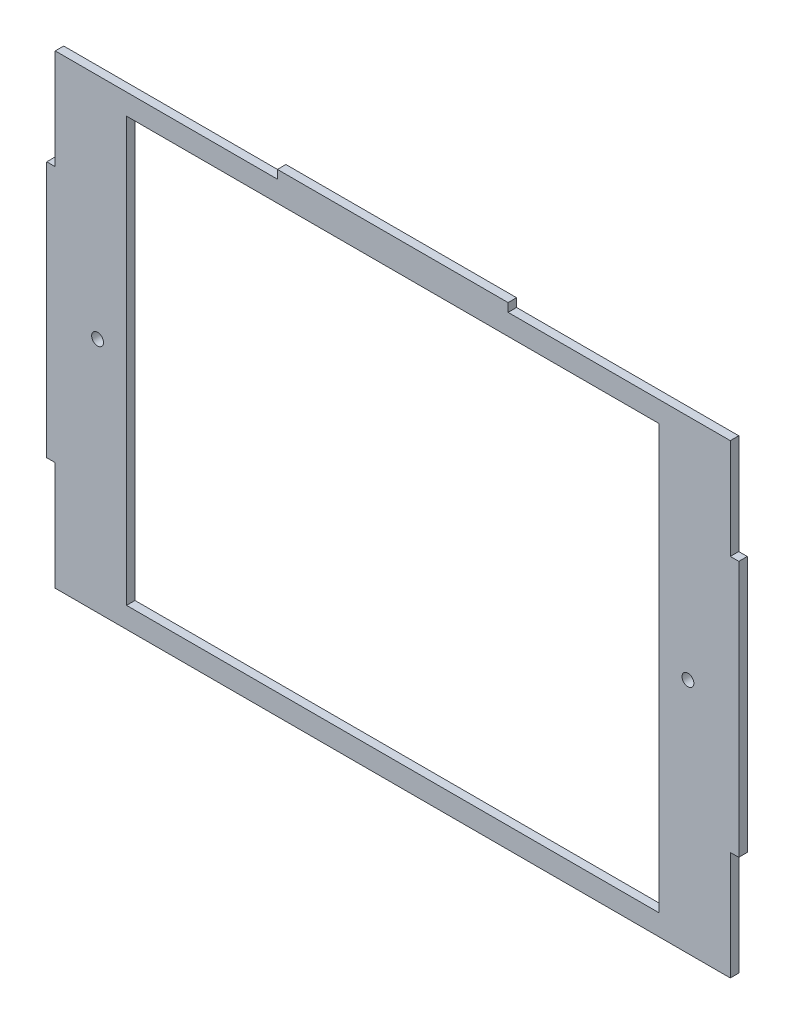
ISO-10303-21;
HEADER;
FILE_DESCRIPTION(('STEP AP214'),'2;1');
FILE_NAME('part.step','',(''),(''),'','','');
FILE_SCHEMA(('AUTOMOTIVE_DESIGN { 1 0 10303 214 1 1 1 1 }'));
ENDSEC;
DATA;
#1=APPLICATION_CONTEXT('core data for automotive mechanical design processes');
#2=APPLICATION_PROTOCOL_DEFINITION('international standard','automotive_design',2000,#1);
#3=PRODUCT_CONTEXT('',#1,'mechanical');
#4=PRODUCT('Part','Part','',(#3));
#5=PRODUCT_RELATED_PRODUCT_CATEGORY('part','',(#4));
#6=PRODUCT_DEFINITION_FORMATION('','',#4);
#7=PRODUCT_DEFINITION_CONTEXT('part definition',#1,'design');
#8=PRODUCT_DEFINITION('design','',#6,#7);
#9=PRODUCT_DEFINITION_SHAPE('','',#8);
#10=(LENGTH_UNIT() NAMED_UNIT(*) SI_UNIT(.MILLI.,.METRE.));
#11=(NAMED_UNIT(*) PLANE_ANGLE_UNIT() SI_UNIT($,.RADIAN.));
#12=(NAMED_UNIT(*) SI_UNIT($,.STERADIAN.) SOLID_ANGLE_UNIT());
#13=UNCERTAINTY_MEASURE_WITH_UNIT(LENGTH_MEASURE(1.E-05),#10,'distance_accuracy_value','');
#14=(GEOMETRIC_REPRESENTATION_CONTEXT(3) GLOBAL_UNCERTAINTY_ASSIGNED_CONTEXT((#13)) GLOBAL_UNIT_ASSIGNED_CONTEXT((#10,
#11,#12)) REPRESENTATION_CONTEXT('',''));
#15=CARTESIAN_POINT('',(0.,0.,0.));
#16=DIRECTION('',(0.,0.,1.));
#17=DIRECTION('',(1.,0.,0.));
#18=AXIS2_PLACEMENT_3D('',#15,#16,#17);
#19=CARTESIAN_POINT('',(0.,0.,0.));
#20=DIRECTION('',(0.,0.,-1.));
#21=DIRECTION('',(-1.,0.,0.));
#22=AXIS2_PLACEMENT_3D('',#19,#20,#21);
#23=PLANE('',#22);
#24=CARTESIAN_POINT('',(36.,167.75,0.));
#25=DIRECTION('',(0.,0.,1.));
#26=DIRECTION('',(1.,0.,0.));
#27=AXIS2_PLACEMENT_3D('',#24,#25,#26);
#28=CIRCLE('',#27,4.2);
#29=CARTESIAN_POINT('',(40.2,167.75,0.));
#30=VERTEX_POINT('',#29);
#31=EDGE_CURVE('E600',#30,#30,#28,.T.);
#32=ORIENTED_EDGE('',*,*,#31,.T.);
#33=EDGE_LOOP('',(#32));
#34=FACE_BOUND('',#33,.T.);
#35=DIRECTION('',(0.,-1.,0.));
#36=VECTOR('',#35,1.);
#37=CARTESIAN_POINT('',(56.5,14.75,0.));
#38=LINE('',#37,#36);
#39=CARTESIAN_POINT('',(56.5,314.75,0.));
#40=VERTEX_POINT('',#39);
#41=CARTESIAN_POINT('',(56.5,14.75,0.));
#42=VERTEX_POINT('',#41);
#43=EDGE_CURVE('E219',#40,#42,#38,.T.);
#44=ORIENTED_EDGE('',*,*,#43,.T.);
#45=DIRECTION('',(1.,0.,0.));
#46=VECTOR('',#45,1.);
#47=CARTESIAN_POINT('',(56.5,14.75,0.));
#48=LINE('',#47,#46);
#49=CARTESIAN_POINT('',(433.5,14.75,0.));
#50=VERTEX_POINT('',#49);
#51=EDGE_CURVE('E222',#42,#50,#48,.T.);
#52=ORIENTED_EDGE('',*,*,#51,.T.);
#53=DIRECTION('',(0.,1.,0.));
#54=VECTOR('',#53,1.);
#55=CARTESIAN_POINT('',(433.5,14.75,0.));
#56=LINE('',#55,#54);
#57=CARTESIAN_POINT('',(433.5,314.75,0.));
#58=VERTEX_POINT('',#57);
#59=EDGE_CURVE('E226',#50,#58,#56,.T.);
#60=ORIENTED_EDGE('',*,*,#59,.T.);
#61=DIRECTION('',(-1.,0.,0.));
#62=VECTOR('',#61,1.);
#63=CARTESIAN_POINT('',(56.5,314.75,0.));
#64=LINE('',#63,#62);
#65=EDGE_CURVE('E229',#58,#40,#64,.T.);
#66=ORIENTED_EDGE('',*,*,#65,.T.);
#67=EDGE_LOOP('',(#44,#52,#60,#66));
#68=FACE_BOUND('',#67,.T.);
#69=DIRECTION('',(0.,1.,0.));
#70=VECTOR('',#69,1.);
#71=CARTESIAN_POINT('',(163.333333333333,335.5,0.));
#72=LINE('',#71,#70);
#73=CARTESIAN_POINT('',(163.333333333333,329.5,0.));
#74=VERTEX_POINT('',#73);
#75=CARTESIAN_POINT('',(163.333333333333,335.5,0.));
#76=VERTEX_POINT('',#75);
#77=EDGE_CURVE('E181',#74,#76,#72,.T.);
#78=ORIENTED_EDGE('',*,*,#77,.T.);
#79=DIRECTION('',(-1.,0.,0.));
#80=VECTOR('',#79,1.);
#81=CARTESIAN_POINT('',(0.,335.5,0.));
#82=LINE('',#81,#80);
#83=CARTESIAN_POINT('',(326.666666666667,335.5,0.));
#84=VERTEX_POINT('',#83);
#85=EDGE_CURVE('E37',#84,#76,#82,.T.);
#86=ORIENTED_EDGE('',*,*,#85,.F.);
#87=DIRECTION('',(0.,-1.,0.));
#88=VECTOR('',#87,1.);
#89=CARTESIAN_POINT('',(326.666666666667,335.5,0.));
#90=LINE('',#89,#88);
#91=CARTESIAN_POINT('',(326.666666666667,329.5,0.));
#92=VERTEX_POINT('',#91);
#93=EDGE_CURVE('E203',#84,#92,#90,.T.);
#94=ORIENTED_EDGE('',*,*,#93,.T.);
#95=DIRECTION('',(1.,0.,0.));
#96=VECTOR('',#95,1.);
#97=CARTESIAN_POINT('',(484.,329.5,0.));
#98=LINE('',#97,#96);
#99=CARTESIAN_POINT('',(484.,329.5,0.));
#100=VERTEX_POINT('',#99);
#101=EDGE_CURVE('E206',#92,#100,#98,.T.);
#102=ORIENTED_EDGE('',*,*,#101,.T.);
#103=DIRECTION('',(0.,-1.,0.));
#104=VECTOR('',#103,1.);
#105=CARTESIAN_POINT('',(484.,335.5,0.));
#106=LINE('',#105,#104);
#107=CARTESIAN_POINT('',(484.,258.5,0.));
#108=VERTEX_POINT('',#107);
#109=EDGE_CURVE('E271',#100,#108,#106,.T.);
#110=ORIENTED_EDGE('',*,*,#109,.T.);
#111=DIRECTION('',(1.,0.,0.));
#112=VECTOR('',#111,1.);
#113=CARTESIAN_POINT('',(490.,258.5,0.));
#114=LINE('',#113,#112);
#115=CARTESIAN_POINT('',(490.,258.5,0.));
#116=VERTEX_POINT('',#115);
#117=EDGE_CURVE('E273',#108,#116,#114,.T.);
#118=ORIENTED_EDGE('',*,*,#117,.T.);
#119=DIRECTION('',(0.,1.,0.));
#120=VECTOR('',#119,1.);
#121=CARTESIAN_POINT('',(490.,0.,0.));
#122=LINE('',#121,#120);
#123=CARTESIAN_POINT('',(490.,77.,0.));
#124=VERTEX_POINT('',#123);
#125=EDGE_CURVE('E327',#124,#116,#122,.T.);
#126=ORIENTED_EDGE('',*,*,#125,.F.);
#127=DIRECTION('',(-1.,0.,0.));
#128=VECTOR('',#127,1.);
#129=CARTESIAN_POINT('',(490.,77.,0.));
#130=LINE('',#129,#128);
#131=CARTESIAN_POINT('',(484.,77.,0.));
#132=VERTEX_POINT('',#131);
#133=EDGE_CURVE('E286',#124,#132,#130,.T.);
#134=ORIENTED_EDGE('',*,*,#133,.T.);
#135=DIRECTION('',(0.,-1.,0.));
#136=VECTOR('',#135,1.);
#137=CARTESIAN_POINT('',(484.,0.,0.));
#138=LINE('',#137,#136);
#139=CARTESIAN_POINT('',(484.,0.,0.));
#140=VERTEX_POINT('',#139);
#141=EDGE_CURVE('E289',#132,#140,#138,.T.);
#142=ORIENTED_EDGE('',*,*,#141,.T.);
#143=DIRECTION('',(1.,0.,0.));
#144=VECTOR('',#143,1.);
#145=CARTESIAN_POINT('',(0.,0.,0.));
#146=LINE('',#145,#144);
#147=CARTESIAN_POINT('',(6.00000000000004,0.,0.));
#148=VERTEX_POINT('',#147);
#149=EDGE_CURVE('E325',#148,#140,#146,.T.);
#150=ORIENTED_EDGE('',*,*,#149,.F.);
#151=DIRECTION('',(0.,1.,0.));
#152=VECTOR('',#151,1.);
#153=CARTESIAN_POINT('',(6.00000000000004,0.,0.));
#154=LINE('',#153,#152);
#155=CARTESIAN_POINT('',(6.00000000000004,77.,0.));
#156=VERTEX_POINT('',#155);
#157=EDGE_CURVE('E251',#148,#156,#154,.T.);
#158=ORIENTED_EDGE('',*,*,#157,.T.);
#159=DIRECTION('',(-1.,0.,0.));
#160=VECTOR('',#159,1.);
#161=CARTESIAN_POINT('',(0.,77.,0.));
#162=LINE('',#161,#160);
#163=CARTESIAN_POINT('',(0.,77.,0.));
#164=VERTEX_POINT('',#163);
#165=EDGE_CURVE('E254',#156,#164,#162,.T.);
#166=ORIENTED_EDGE('',*,*,#165,.T.);
#167=DIRECTION('',(0.,-1.,0.));
#168=VECTOR('',#167,1.);
#169=CARTESIAN_POINT('',(0.,0.,0.));
#170=LINE('',#169,#168);
#171=CARTESIAN_POINT('',(0.,258.5,0.));
#172=VERTEX_POINT('',#171);
#173=EDGE_CURVE('E313',#172,#164,#170,.T.);
#174=ORIENTED_EDGE('',*,*,#173,.F.);
#175=DIRECTION('',(1.,0.,0.));
#176=VECTOR('',#175,1.);
#177=CARTESIAN_POINT('',(0.,258.5,0.));
#178=LINE('',#177,#176);
#179=CARTESIAN_POINT('',(6.00000000000001,258.5,0.));
#180=VERTEX_POINT('',#179);
#181=EDGE_CURVE('E302',#172,#180,#178,.T.);
#182=ORIENTED_EDGE('',*,*,#181,.T.);
#183=DIRECTION('',(0.,1.,0.));
#184=VECTOR('',#183,1.);
#185=CARTESIAN_POINT('',(6.,335.5,0.));
#186=LINE('',#185,#184);
#187=CARTESIAN_POINT('',(6.,329.5,0.));
#188=VERTEX_POINT('',#187);
#189=EDGE_CURVE('E191',#180,#188,#186,.T.);
#190=ORIENTED_EDGE('',*,*,#189,.T.);
#191=DIRECTION('',(1.,0.,0.));
#192=VECTOR('',#191,1.);
#193=CARTESIAN_POINT('',(6.,329.5,0.));
#194=LINE('',#193,#192);
#195=EDGE_CURVE('E50',#188,#74,#194,.T.);
#196=ORIENTED_EDGE('',*,*,#195,.T.);
#197=EDGE_LOOP('',(#78,#86,#94,#102,#110,#118,#126,#134,#142,#150,#158,#166,#174,#182,#190,#196));
#198=FACE_BOUND('',#197,.T.);
#199=CARTESIAN_POINT('',(454.,167.75,0.));
#200=DIRECTION('',(0.,0.,1.));
#201=DIRECTION('',(1.,0.,0.));
#202=AXIS2_PLACEMENT_3D('',#199,#200,#201);
#203=CIRCLE('',#202,4.19999999999998);
#204=CARTESIAN_POINT('',(458.2,167.75,0.));
#205=VERTEX_POINT('',#204);
#206=EDGE_CURVE('E196',#205,#205,#203,.T.);
#207=ORIENTED_EDGE('',*,*,#206,.T.);
#208=EDGE_LOOP('',(#207));
#209=FACE_BOUND('',#208,.T.);
#210=ADVANCED_FACE('F33',(#34,#68,#198,#209),#23,.T.);
#211=CARTESIAN_POINT('',(0.,0.,6.));
#212=DIRECTION('',(0.,0.,-1.));
#213=DIRECTION('',(-1.,0.,0.));
#214=AXIS2_PLACEMENT_3D('',#211,#212,#213);
#215=PLANE('',#214);
#216=CARTESIAN_POINT('',(36.,167.75,6.));
#217=DIRECTION('',(0.,0.,1.));
#218=DIRECTION('',(1.,0.,0.));
#219=AXIS2_PLACEMENT_3D('',#216,#217,#218);
#220=CIRCLE('',#219,4.19999999999999);
#221=CARTESIAN_POINT('',(40.2,167.75,6.));
#222=VERTEX_POINT('',#221);
#223=EDGE_CURVE('E603',#222,#222,#220,.T.);
#224=ORIENTED_EDGE('',*,*,#223,.F.);
#225=EDGE_LOOP('',(#224));
#226=FACE_BOUND('',#225,.T.);
#227=DIRECTION('',(1.,0.,0.));
#228=VECTOR('',#227,1.);
#229=CARTESIAN_POINT('',(56.5,14.75,6.));
#230=LINE('',#229,#228);
#231=CARTESIAN_POINT('',(56.5,14.75,6.));
#232=VERTEX_POINT('',#231);
#233=CARTESIAN_POINT('',(433.5,14.75,6.));
#234=VERTEX_POINT('',#233);
#235=EDGE_CURVE('E234',#232,#234,#230,.T.);
#236=ORIENTED_EDGE('',*,*,#235,.F.);
#237=DIRECTION('',(0.,-1.,0.));
#238=VECTOR('',#237,1.);
#239=CARTESIAN_POINT('',(56.5,14.75,6.));
#240=LINE('',#239,#238);
#241=CARTESIAN_POINT('',(56.5,314.75,6.));
#242=VERTEX_POINT('',#241);
#243=EDGE_CURVE('E215',#242,#232,#240,.T.);
#244=ORIENTED_EDGE('',*,*,#243,.F.);
#245=DIRECTION('',(-1.,0.,0.));
#246=VECTOR('',#245,1.);
#247=CARTESIAN_POINT('',(56.5,314.75,6.));
#248=LINE('',#247,#246);
#249=CARTESIAN_POINT('',(433.5,314.75,6.));
#250=VERTEX_POINT('',#249);
#251=EDGE_CURVE('E223',#250,#242,#248,.T.);
#252=ORIENTED_EDGE('',*,*,#251,.F.);
#253=DIRECTION('',(0.,1.,0.));
#254=VECTOR('',#253,1.);
#255=CARTESIAN_POINT('',(433.5,14.75,6.));
#256=LINE('',#255,#254);
#257=EDGE_CURVE('E237',#234,#250,#256,.T.);
#258=ORIENTED_EDGE('',*,*,#257,.F.);
#259=EDGE_LOOP('',(#236,#244,#252,#258));
#260=FACE_BOUND('',#259,.T.);
#261=DIRECTION('',(-1.,0.,0.));
#262=VECTOR('',#261,1.);
#263=CARTESIAN_POINT('',(0.,335.5,6.));
#264=LINE('',#263,#262);
#265=CARTESIAN_POINT('',(326.666666666667,335.5,6.));
#266=VERTEX_POINT('',#265);
#267=CARTESIAN_POINT('',(163.333333333333,335.5,6.));
#268=VERTEX_POINT('',#267);
#269=EDGE_CURVE('E11',#266,#268,#264,.T.);
#270=ORIENTED_EDGE('',*,*,#269,.T.);
#271=DIRECTION('',(0.,1.,0.));
#272=VECTOR('',#271,1.);
#273=CARTESIAN_POINT('',(163.333333333333,335.5,6.));
#274=LINE('',#273,#272);
#275=CARTESIAN_POINT('',(163.333333333333,329.5,6.));
#276=VERTEX_POINT('',#275);
#277=EDGE_CURVE('E192',#276,#268,#274,.T.);
#278=ORIENTED_EDGE('',*,*,#277,.F.);
#279=DIRECTION('',(1.,0.,0.));
#280=VECTOR('',#279,1.);
#281=CARTESIAN_POINT('',(6.,329.5,6.));
#282=LINE('',#281,#280);
#283=CARTESIAN_POINT('',(6.,329.5,6.));
#284=VERTEX_POINT('',#283);
#285=EDGE_CURVE('E174',#284,#276,#282,.T.);
#286=ORIENTED_EDGE('',*,*,#285,.F.);
#287=DIRECTION('',(0.,1.,0.));
#288=VECTOR('',#287,1.);
#289=CARTESIAN_POINT('',(6.,335.5,6.));
#290=LINE('',#289,#288);
#291=CARTESIAN_POINT('',(6.00000000000001,258.5,6.));
#292=VERTEX_POINT('',#291);
#293=EDGE_CURVE('E304',#292,#284,#290,.T.);
#294=ORIENTED_EDGE('',*,*,#293,.F.);
#295=DIRECTION('',(1.,0.,0.));
#296=VECTOR('',#295,1.);
#297=CARTESIAN_POINT('',(0.,258.5,6.));
#298=LINE('',#297,#296);
#299=CARTESIAN_POINT('',(0.,258.5,6.));
#300=VERTEX_POINT('',#299);
#301=EDGE_CURVE('E267',#300,#292,#298,.T.);
#302=ORIENTED_EDGE('',*,*,#301,.F.);
#303=DIRECTION('',(0.,-1.,0.));
#304=VECTOR('',#303,1.);
#305=CARTESIAN_POINT('',(0.,0.,6.));
#306=LINE('',#305,#304);
#307=CARTESIAN_POINT('',(0.,77.,6.));
#308=VERTEX_POINT('',#307);
#309=EDGE_CURVE('E315',#300,#308,#306,.T.);
#310=ORIENTED_EDGE('',*,*,#309,.T.);
#311=DIRECTION('',(-1.,0.,0.));
#312=VECTOR('',#311,1.);
#313=CARTESIAN_POINT('',(0.,77.,6.));
#314=LINE('',#313,#312);
#315=CARTESIAN_POINT('',(6.00000000000004,77.,6.));
#316=VERTEX_POINT('',#315);
#317=EDGE_CURVE('E255',#316,#308,#314,.T.);
#318=ORIENTED_EDGE('',*,*,#317,.F.);
#319=DIRECTION('',(0.,1.,0.));
#320=VECTOR('',#319,1.);
#321=CARTESIAN_POINT('',(6.00000000000004,0.,6.));
#322=LINE('',#321,#320);
#323=CARTESIAN_POINT('',(6.00000000000004,0.,6.));
#324=VERTEX_POINT('',#323);
#325=EDGE_CURVE('E259',#324,#316,#322,.T.);
#326=ORIENTED_EDGE('',*,*,#325,.F.);
#327=DIRECTION('',(1.,0.,0.));
#328=VECTOR('',#327,1.);
#329=CARTESIAN_POINT('',(0.,0.,6.));
#330=LINE('',#329,#328);
#331=CARTESIAN_POINT('',(484.,0.,6.));
#332=VERTEX_POINT('',#331);
#333=EDGE_CURVE('E318',#324,#332,#330,.T.);
#334=ORIENTED_EDGE('',*,*,#333,.T.);
#335=DIRECTION('',(0.,-1.,0.));
#336=VECTOR('',#335,1.);
#337=CARTESIAN_POINT('',(484.,0.,6.));
#338=LINE('',#337,#336);
#339=CARTESIAN_POINT('',(484.,77.,6.));
#340=VERTEX_POINT('',#339);
#341=EDGE_CURVE('E290',#340,#332,#338,.T.);
#342=ORIENTED_EDGE('',*,*,#341,.F.);
#343=DIRECTION('',(-1.,0.,0.));
#344=VECTOR('',#343,1.);
#345=CARTESIAN_POINT('',(490.,77.,6.));
#346=LINE('',#345,#344);
#347=CARTESIAN_POINT('',(490.,77.,6.));
#348=VERTEX_POINT('',#347);
#349=EDGE_CURVE('E244',#348,#340,#346,.T.);
#350=ORIENTED_EDGE('',*,*,#349,.F.);
#351=DIRECTION('',(0.,1.,0.));
#352=VECTOR('',#351,1.);
#353=CARTESIAN_POINT('',(490.,0.,6.));
#354=LINE('',#353,#352);
#355=CARTESIAN_POINT('',(490.,258.5,6.));
#356=VERTEX_POINT('',#355);
#357=EDGE_CURVE('E42',#348,#356,#354,.T.);
#358=ORIENTED_EDGE('',*,*,#357,.T.);
#359=DIRECTION('',(1.,0.,0.));
#360=VECTOR('',#359,1.);
#361=CARTESIAN_POINT('',(490.,258.5,6.));
#362=LINE('',#361,#360);
#363=CARTESIAN_POINT('',(484.,258.5,6.));
#364=VERTEX_POINT('',#363);
#365=EDGE_CURVE('E274',#364,#356,#362,.T.);
#366=ORIENTED_EDGE('',*,*,#365,.F.);
#367=DIRECTION('',(0.,-1.,0.));
#368=VECTOR('',#367,1.);
#369=CARTESIAN_POINT('',(484.,335.5,6.));
#370=LINE('',#369,#368);
#371=CARTESIAN_POINT('',(484.,329.5,6.));
#372=VERTEX_POINT('',#371);
#373=EDGE_CURVE('E278',#372,#364,#370,.T.);
#374=ORIENTED_EDGE('',*,*,#373,.F.);
#375=DIRECTION('',(1.,0.,0.));
#376=VECTOR('',#375,1.);
#377=CARTESIAN_POINT('',(484.,329.5,6.));
#378=LINE('',#377,#376);
#379=CARTESIAN_POINT('',(326.666666666667,329.5,6.));
#380=VERTEX_POINT('',#379);
#381=EDGE_CURVE('E58',#380,#372,#378,.T.);
#382=ORIENTED_EDGE('',*,*,#381,.F.);
#383=DIRECTION('',(0.,-1.,0.));
#384=VECTOR('',#383,1.);
#385=CARTESIAN_POINT('',(326.666666666667,335.5,6.));
#386=LINE('',#385,#384);
#387=EDGE_CURVE('E200',#266,#380,#386,.T.);
#388=ORIENTED_EDGE('',*,*,#387,.F.);
#389=EDGE_LOOP('',(#270,#278,#286,#294,#302,#310,#318,#326,#334,#342,#350,#358,#366,#374,#382,#388));
#390=FACE_BOUND('',#389,.T.);
#391=CARTESIAN_POINT('',(454.,167.75,6.));
#392=DIRECTION('',(0.,0.,1.));
#393=DIRECTION('',(1.,0.,0.));
#394=AXIS2_PLACEMENT_3D('',#391,#392,#393);
#395=CIRCLE('',#394,4.19999999999998);
#396=CARTESIAN_POINT('',(458.2,167.75,6.));
#397=VERTEX_POINT('',#396);
#398=EDGE_CURVE('E605',#397,#397,#395,.T.);
#399=ORIENTED_EDGE('',*,*,#398,.F.);
#400=EDGE_LOOP('',(#399));
#401=FACE_BOUND('',#400,.T.);
#402=ADVANCED_FACE('F348',(#226,#260,#390,#401),#215,.F.);
#403=CARTESIAN_POINT('',(0.,0.,6.));
#404=DIRECTION('',(1.,0.,0.));
#405=DIRECTION('',(0.,0.,-1.));
#406=AXIS2_PLACEMENT_3D('',#403,#404,#405);
#407=PLANE('',#406);
#408=ORIENTED_EDGE('',*,*,#173,.T.);
#409=DIRECTION('',(0.,0.,1.));
#410=VECTOR('',#409,1.);
#411=CARTESIAN_POINT('',(0.,77.,0.));
#412=LINE('',#411,#410);
#413=EDGE_CURVE('E264',#164,#308,#412,.T.);
#414=ORIENTED_EDGE('',*,*,#413,.T.);
#415=ORIENTED_EDGE('',*,*,#309,.F.);
#416=DIRECTION('',(0.,0.,1.));
#417=VECTOR('',#416,1.);
#418=CARTESIAN_POINT('',(0.,258.5,0.));
#419=LINE('',#418,#417);
#420=EDGE_CURVE('E306',#172,#300,#419,.T.);
#421=ORIENTED_EDGE('',*,*,#420,.F.);
#422=EDGE_LOOP('',(#408,#414,#415,#421));
#423=FACE_BOUND('',#422,.T.);
#424=ADVANCED_FACE('F35',(#423),#407,.F.);
#425=CARTESIAN_POINT('',(0.,0.,6.));
#426=DIRECTION('',(0.,1.,0.));
#427=DIRECTION('',(0.,0.,1.));
#428=AXIS2_PLACEMENT_3D('',#425,#426,#427);
#429=PLANE('',#428);
#430=ORIENTED_EDGE('',*,*,#333,.F.);
#431=DIRECTION('',(0.,0.,1.));
#432=VECTOR('',#431,1.);
#433=CARTESIAN_POINT('',(6.00000000000004,0.,0.));
#434=LINE('',#433,#432);
#435=EDGE_CURVE('E258',#148,#324,#434,.T.);
#436=ORIENTED_EDGE('',*,*,#435,.F.);
#437=ORIENTED_EDGE('',*,*,#149,.T.);
#438=DIRECTION('',(0.,0.,1.));
#439=VECTOR('',#438,1.);
#440=CARTESIAN_POINT('',(484.,0.,0.));
#441=LINE('',#440,#439);
#442=EDGE_CURVE('E280',#140,#332,#441,.T.);
#443=ORIENTED_EDGE('',*,*,#442,.T.);
#444=EDGE_LOOP('',(#430,#436,#437,#443));
#445=FACE_BOUND('',#444,.T.);
#446=ADVANCED_FACE('F365',(#445),#429,.F.);
#447=CARTESIAN_POINT('',(490.,0.,6.));
#448=DIRECTION('',(-1.,0.,0.));
#449=DIRECTION('',(0.,0.,1.));
#450=AXIS2_PLACEMENT_3D('',#447,#448,#449);
#451=PLANE('',#450);
#452=ORIENTED_EDGE('',*,*,#125,.T.);
#453=DIRECTION('',(0.,0.,1.));
#454=VECTOR('',#453,1.);
#455=CARTESIAN_POINT('',(490.,258.5,0.));
#456=LINE('',#455,#454);
#457=EDGE_CURVE('E262',#116,#356,#456,.T.);
#458=ORIENTED_EDGE('',*,*,#457,.T.);
#459=ORIENTED_EDGE('',*,*,#357,.F.);
#460=DIRECTION('',(0.,0.,1.));
#461=VECTOR('',#460,1.);
#462=CARTESIAN_POINT('',(490.,77.,0.));
#463=LINE('',#462,#461);
#464=EDGE_CURVE('E293',#124,#348,#463,.T.);
#465=ORIENTED_EDGE('',*,*,#464,.F.);
#466=EDGE_LOOP('',(#452,#458,#459,#465));
#467=FACE_BOUND('',#466,.T.);
#468=ADVANCED_FACE('F355',(#467),#451,.F.);
#469=CARTESIAN_POINT('',(0.,335.5,6.));
#470=DIRECTION('',(0.,-1.,0.));
#471=DIRECTION('',(0.,0.,-1.));
#472=AXIS2_PLACEMENT_3D('',#469,#470,#471);
#473=PLANE('',#472);
#474=ORIENTED_EDGE('',*,*,#85,.T.);
#475=DIRECTION('',(0.,0.,1.));
#476=VECTOR('',#475,1.);
#477=CARTESIAN_POINT('',(163.333333333333,335.5,0.));
#478=LINE('',#477,#476);
#479=EDGE_CURVE('E177',#76,#268,#478,.T.);
#480=ORIENTED_EDGE('',*,*,#479,.T.);
#481=ORIENTED_EDGE('',*,*,#269,.F.);
#482=DIRECTION('',(0.,0.,1.));
#483=VECTOR('',#482,1.);
#484=CARTESIAN_POINT('',(326.666666666667,335.5,0.));
#485=LINE('',#484,#483);
#486=EDGE_CURVE('E209',#84,#266,#485,.T.);
#487=ORIENTED_EDGE('',*,*,#486,.F.);
#488=EDGE_LOOP('',(#474,#480,#481,#487));
#489=FACE_BOUND('',#488,.T.);
#490=ADVANCED_FACE('F334',(#489),#473,.F.);
#491=CARTESIAN_POINT('',(6.,335.5,0.));
#492=DIRECTION('',(1.,0.,0.));
#493=DIRECTION('',(0.,1.,0.));
#494=AXIS2_PLACEMENT_3D('',#491,#492,#493);
#495=PLANE('',#494);
#496=ORIENTED_EDGE('',*,*,#293,.T.);
#497=DIRECTION('',(0.,0.,1.));
#498=VECTOR('',#497,1.);
#499=CARTESIAN_POINT('',(6.,329.5,0.));
#500=LINE('',#499,#498);
#501=EDGE_CURVE('E178',#188,#284,#500,.T.);
#502=ORIENTED_EDGE('',*,*,#501,.F.);
#503=ORIENTED_EDGE('',*,*,#189,.F.);
#504=DIRECTION('',(0.,0.,1.));
#505=VECTOR('',#504,1.);
#506=CARTESIAN_POINT('',(6.00000000000001,258.5,0.));
#507=LINE('',#506,#505);
#508=EDGE_CURVE('E311',#180,#292,#507,.T.);
#509=ORIENTED_EDGE('',*,*,#508,.T.);
#510=EDGE_LOOP('',(#496,#502,#503,#509));
#511=FACE_BOUND('',#510,.T.);
#512=ADVANCED_FACE('F383',(#511),#495,.F.);
#513=CARTESIAN_POINT('',(0.,258.5,0.));
#514=DIRECTION('',(0.,-1.,0.));
#515=DIRECTION('',(0.,0.,-1.));
#516=AXIS2_PLACEMENT_3D('',#513,#514,#515);
#517=PLANE('',#516);
#518=ORIENTED_EDGE('',*,*,#301,.T.);
#519=ORIENTED_EDGE('',*,*,#508,.F.);
#520=ORIENTED_EDGE('',*,*,#181,.F.);
#521=ORIENTED_EDGE('',*,*,#420,.T.);
#522=EDGE_LOOP('',(#518,#519,#520,#521));
#523=FACE_BOUND('',#522,.T.);
#524=ADVANCED_FACE('F379',(#523),#517,.F.);
#525=CARTESIAN_POINT('',(484.,0.,0.));
#526=DIRECTION('',(-1.,0.,0.));
#527=DIRECTION('',(0.,-1.,0.));
#528=AXIS2_PLACEMENT_3D('',#525,#526,#527);
#529=PLANE('',#528);
#530=ORIENTED_EDGE('',*,*,#341,.T.);
#531=ORIENTED_EDGE('',*,*,#442,.F.);
#532=ORIENTED_EDGE('',*,*,#141,.F.);
#533=DIRECTION('',(0.,0.,1.));
#534=VECTOR('',#533,1.);
#535=CARTESIAN_POINT('',(484.,77.,0.));
#536=LINE('',#535,#534);
#537=EDGE_CURVE('E299',#132,#340,#536,.T.);
#538=ORIENTED_EDGE('',*,*,#537,.T.);
#539=EDGE_LOOP('',(#530,#531,#532,#538));
#540=FACE_BOUND('',#539,.T.);
#541=ADVANCED_FACE('F362',(#540),#529,.F.);
#542=CARTESIAN_POINT('',(490.,77.,0.));
#543=DIRECTION('',(0.,1.,0.));
#544=DIRECTION('',(0.,0.,1.));
#545=AXIS2_PLACEMENT_3D('',#542,#543,#544);
#546=PLANE('',#545);
#547=ORIENTED_EDGE('',*,*,#349,.T.);
#548=ORIENTED_EDGE('',*,*,#537,.F.);
#549=ORIENTED_EDGE('',*,*,#133,.F.);
#550=ORIENTED_EDGE('',*,*,#464,.T.);
#551=EDGE_LOOP('',(#547,#548,#549,#550));
#552=FACE_BOUND('',#551,.T.);
#553=ADVANCED_FACE('F359',(#552),#546,.F.);
#554=CARTESIAN_POINT('',(490.,258.5,0.));
#555=DIRECTION('',(0.,-1.,0.));
#556=DIRECTION('',(0.,0.,-1.));
#557=AXIS2_PLACEMENT_3D('',#554,#555,#556);
#558=PLANE('',#557);
#559=ORIENTED_EDGE('',*,*,#365,.T.);
#560=ORIENTED_EDGE('',*,*,#457,.F.);
#561=ORIENTED_EDGE('',*,*,#117,.F.);
#562=DIRECTION('',(0.,0.,1.));
#563=VECTOR('',#562,1.);
#564=CARTESIAN_POINT('',(484.,258.5,0.));
#565=LINE('',#564,#563);
#566=EDGE_CURVE('E277',#108,#364,#565,.T.);
#567=ORIENTED_EDGE('',*,*,#566,.T.);
#568=EDGE_LOOP('',(#559,#560,#561,#567));
#569=FACE_BOUND('',#568,.T.);
#570=ADVANCED_FACE('F353',(#569),#558,.F.);
#571=CARTESIAN_POINT('',(484.,335.5,0.));
#572=DIRECTION('',(-1.,0.,0.));
#573=DIRECTION('',(0.,0.,1.));
#574=AXIS2_PLACEMENT_3D('',#571,#572,#573);
#575=PLANE('',#574);
#576=ORIENTED_EDGE('',*,*,#109,.F.);
#577=DIRECTION('',(0.,0.,1.));
#578=VECTOR('',#577,1.);
#579=CARTESIAN_POINT('',(484.,329.5,0.));
#580=LINE('',#579,#578);
#581=EDGE_CURVE('E213',#100,#372,#580,.T.);
#582=ORIENTED_EDGE('',*,*,#581,.T.);
#583=ORIENTED_EDGE('',*,*,#373,.T.);
#584=ORIENTED_EDGE('',*,*,#566,.F.);
#585=EDGE_LOOP('',(#576,#582,#583,#584));
#586=FACE_BOUND('',#585,.T.);
#587=ADVANCED_FACE('F344',(#586),#575,.F.);
#588=CARTESIAN_POINT('',(0.,77.,0.));
#589=DIRECTION('',(0.,1.,0.));
#590=DIRECTION('',(0.,0.,1.));
#591=AXIS2_PLACEMENT_3D('',#588,#589,#590);
#592=PLANE('',#591);
#593=ORIENTED_EDGE('',*,*,#317,.T.);
#594=ORIENTED_EDGE('',*,*,#413,.F.);
#595=ORIENTED_EDGE('',*,*,#165,.F.);
#596=DIRECTION('',(0.,0.,1.));
#597=VECTOR('',#596,1.);
#598=CARTESIAN_POINT('',(6.00000000000004,77.,0.));
#599=LINE('',#598,#597);
#600=EDGE_CURVE('E268',#156,#316,#599,.T.);
#601=ORIENTED_EDGE('',*,*,#600,.T.);
#602=EDGE_LOOP('',(#593,#594,#595,#601));
#603=FACE_BOUND('',#602,.T.);
#604=ADVANCED_FACE('F470',(#603),#592,.F.);
#605=CARTESIAN_POINT('',(6.00000000000004,0.,0.));
#606=DIRECTION('',(1.,0.,0.));
#607=DIRECTION('',(0.,1.,0.));
#608=AXIS2_PLACEMENT_3D('',#605,#606,#607);
#609=PLANE('',#608);
#610=ORIENTED_EDGE('',*,*,#325,.T.);
#611=ORIENTED_EDGE('',*,*,#600,.F.);
#612=ORIENTED_EDGE('',*,*,#157,.F.);
#613=ORIENTED_EDGE('',*,*,#435,.T.);
#614=EDGE_LOOP('',(#610,#611,#612,#613));
#615=FACE_BOUND('',#614,.T.);
#616=ADVANCED_FACE('F371',(#615),#609,.F.);
#617=CARTESIAN_POINT('',(56.5,14.75,0.));
#618=DIRECTION('',(-1.,0.,0.));
#619=DIRECTION('',(0.,0.,1.));
#620=AXIS2_PLACEMENT_3D('',#617,#618,#619);
#621=PLANE('',#620);
#622=ORIENTED_EDGE('',*,*,#243,.T.);
#623=DIRECTION('',(0.,0.,1.));
#624=VECTOR('',#623,1.);
#625=CARTESIAN_POINT('',(56.5,14.75,0.));
#626=LINE('',#625,#624);
#627=EDGE_CURVE('E232',#42,#232,#626,.T.);
#628=ORIENTED_EDGE('',*,*,#627,.F.);
#629=ORIENTED_EDGE('',*,*,#43,.F.);
#630=DIRECTION('',(0.,0.,1.));
#631=VECTOR('',#630,1.);
#632=CARTESIAN_POINT('',(56.5,314.75,0.));
#633=LINE('',#632,#631);
#634=EDGE_CURVE('E242',#40,#242,#633,.T.);
#635=ORIENTED_EDGE('',*,*,#634,.T.);
#636=EDGE_LOOP('',(#622,#628,#629,#635));
#637=FACE_BOUND('',#636,.T.);
#638=ADVANCED_FACE('F459',(#637),#621,.F.);
#639=CARTESIAN_POINT('',(56.5,314.75,0.));
#640=DIRECTION('',(0.,1.,0.));
#641=DIRECTION('',(0.,0.,1.));
#642=AXIS2_PLACEMENT_3D('',#639,#640,#641);
#643=PLANE('',#642);
#644=ORIENTED_EDGE('',*,*,#251,.T.);
#645=ORIENTED_EDGE('',*,*,#634,.F.);
#646=ORIENTED_EDGE('',*,*,#65,.F.);
#647=DIRECTION('',(0.,0.,1.));
#648=VECTOR('',#647,1.);
#649=CARTESIAN_POINT('',(433.5,314.75,0.));
#650=LINE('',#649,#648);
#651=EDGE_CURVE('E245',#58,#250,#650,.T.);
#652=ORIENTED_EDGE('',*,*,#651,.T.);
#653=EDGE_LOOP('',(#644,#645,#646,#652));
#654=FACE_BOUND('',#653,.T.);
#655=ADVANCED_FACE('F455',(#654),#643,.F.);
#656=CARTESIAN_POINT('',(433.5,14.75,0.));
#657=DIRECTION('',(1.,0.,0.));
#658=DIRECTION('',(0.,0.,-1.));
#659=AXIS2_PLACEMENT_3D('',#656,#657,#658);
#660=PLANE('',#659);
#661=ORIENTED_EDGE('',*,*,#257,.T.);
#662=ORIENTED_EDGE('',*,*,#651,.F.);
#663=ORIENTED_EDGE('',*,*,#59,.F.);
#664=DIRECTION('',(0.,0.,1.));
#665=VECTOR('',#664,1.);
#666=CARTESIAN_POINT('',(433.5,14.75,0.));
#667=LINE('',#666,#665);
#668=EDGE_CURVE('E247',#50,#234,#667,.T.);
#669=ORIENTED_EDGE('',*,*,#668,.T.);
#670=EDGE_LOOP('',(#661,#662,#663,#669));
#671=FACE_BOUND('',#670,.T.);
#672=ADVANCED_FACE('F458',(#671),#660,.F.);
#673=CARTESIAN_POINT('',(56.5,14.75,0.));
#674=DIRECTION('',(0.,-1.,0.));
#675=DIRECTION('',(0.,0.,-1.));
#676=AXIS2_PLACEMENT_3D('',#673,#674,#675);
#677=PLANE('',#676);
#678=ORIENTED_EDGE('',*,*,#235,.T.);
#679=ORIENTED_EDGE('',*,*,#668,.F.);
#680=ORIENTED_EDGE('',*,*,#51,.F.);
#681=ORIENTED_EDGE('',*,*,#627,.T.);
#682=EDGE_LOOP('',(#678,#679,#680,#681));
#683=FACE_BOUND('',#682,.T.);
#684=ADVANCED_FACE('F452',(#683),#677,.F.);
#685=CARTESIAN_POINT('',(484.,329.5,0.));
#686=DIRECTION('',(0.,-1.,0.));
#687=DIRECTION('',(0.,0.,-1.));
#688=AXIS2_PLACEMENT_3D('',#685,#686,#687);
#689=PLANE('',#688);
#690=ORIENTED_EDGE('',*,*,#381,.T.);
#691=ORIENTED_EDGE('',*,*,#581,.F.);
#692=ORIENTED_EDGE('',*,*,#101,.F.);
#693=DIRECTION('',(0.,0.,1.));
#694=VECTOR('',#693,1.);
#695=CARTESIAN_POINT('',(326.666666666667,329.5,0.));
#696=LINE('',#695,#694);
#697=EDGE_CURVE('E216',#92,#380,#696,.T.);
#698=ORIENTED_EDGE('',*,*,#697,.T.);
#699=EDGE_LOOP('',(#690,#691,#692,#698));
#700=FACE_BOUND('',#699,.T.);
#701=ADVANCED_FACE('F341',(#700),#689,.F.);
#702=CARTESIAN_POINT('',(326.666666666667,335.5,0.));
#703=DIRECTION('',(-1.,0.,0.));
#704=DIRECTION('',(0.,0.,1.));
#705=AXIS2_PLACEMENT_3D('',#702,#703,#704);
#706=PLANE('',#705);
#707=ORIENTED_EDGE('',*,*,#387,.T.);
#708=ORIENTED_EDGE('',*,*,#697,.F.);
#709=ORIENTED_EDGE('',*,*,#93,.F.);
#710=ORIENTED_EDGE('',*,*,#486,.T.);
#711=EDGE_LOOP('',(#707,#708,#709,#710));
#712=FACE_BOUND('',#711,.T.);
#713=ADVANCED_FACE('F339',(#712),#706,.F.);
#714=CARTESIAN_POINT('',(163.333333333333,335.5,0.));
#715=DIRECTION('',(1.,0.,0.));
#716=DIRECTION('',(0.,0.,-1.));
#717=AXIS2_PLACEMENT_3D('',#714,#715,#716);
#718=PLANE('',#717);
#719=ORIENTED_EDGE('',*,*,#277,.T.);
#720=ORIENTED_EDGE('',*,*,#479,.F.);
#721=ORIENTED_EDGE('',*,*,#77,.F.);
#722=DIRECTION('',(0.,0.,1.));
#723=VECTOR('',#722,1.);
#724=CARTESIAN_POINT('',(163.333333333333,329.5,0.));
#725=LINE('',#724,#723);
#726=EDGE_CURVE('E170',#74,#276,#725,.T.);
#727=ORIENTED_EDGE('',*,*,#726,.T.);
#728=EDGE_LOOP('',(#719,#720,#721,#727));
#729=FACE_BOUND('',#728,.T.);
#730=ADVANCED_FACE('F182',(#729),#718,.F.);
#731=CARTESIAN_POINT('',(6.,329.5,0.));
#732=DIRECTION('',(0.,-1.,0.));
#733=DIRECTION('',(0.,0.,-1.));
#734=AXIS2_PLACEMENT_3D('',#731,#732,#733);
#735=PLANE('',#734);
#736=ORIENTED_EDGE('',*,*,#285,.T.);
#737=ORIENTED_EDGE('',*,*,#726,.F.);
#738=ORIENTED_EDGE('',*,*,#195,.F.);
#739=ORIENTED_EDGE('',*,*,#501,.T.);
#740=EDGE_LOOP('',(#736,#737,#738,#739));
#741=FACE_BOUND('',#740,.T.);
#742=ADVANCED_FACE('F172',(#741),#735,.F.);
#743=CARTESIAN_POINT('',(454.,167.75,6.));
#744=DIRECTION('',(0.,0.,1.));
#745=DIRECTION('',(1.,0.,0.));
#746=AXIS2_PLACEMENT_3D('',#743,#744,#745);
#747=CYLINDRICAL_SURFACE('',#746,4.19999999999998);
#748=ORIENTED_EDGE('',*,*,#206,.F.);
#749=EDGE_LOOP('',(#748));
#750=FACE_BOUND('',#749,.T.);
#751=ORIENTED_EDGE('',*,*,#398,.T.);
#752=EDGE_LOOP('',(#751));
#753=FACE_BOUND('',#752,.T.);
#754=ADVANCED_FACE('F424',(#750,#753),#747,.F.);
#755=CARTESIAN_POINT('',(36.,167.75,6.));
#756=DIRECTION('',(0.,0.,1.));
#757=DIRECTION('',(1.,0.,0.));
#758=AXIS2_PLACEMENT_3D('',#755,#756,#757);
#759=CYLINDRICAL_SURFACE('',#758,4.19999999999999);
#760=ORIENTED_EDGE('',*,*,#31,.F.);
#761=EDGE_LOOP('',(#760));
#762=FACE_BOUND('',#761,.T.);
#763=ORIENTED_EDGE('',*,*,#223,.T.);
#764=EDGE_LOOP('',(#763));
#765=FACE_BOUND('',#764,.T.);
#766=ADVANCED_FACE('F429',(#762,#765),#759,.F.);
#767=CLOSED_SHELL('',(#210,#402,#424,#446,#468,#490,#512,#524,#541,#553,#570,#587,#604,#616,
#638,#655,#672,#684,#701,#713,#730,#742,#754,#766));
#768=MANIFOLD_SOLID_BREP('B2',#767);
#769=ADVANCED_BREP_SHAPE_REPRESENTATION('',(#18,#768),#14);
#770=SHAPE_DEFINITION_REPRESENTATION(#9,#769);
ENDSEC;
END-ISO-10303-21;
